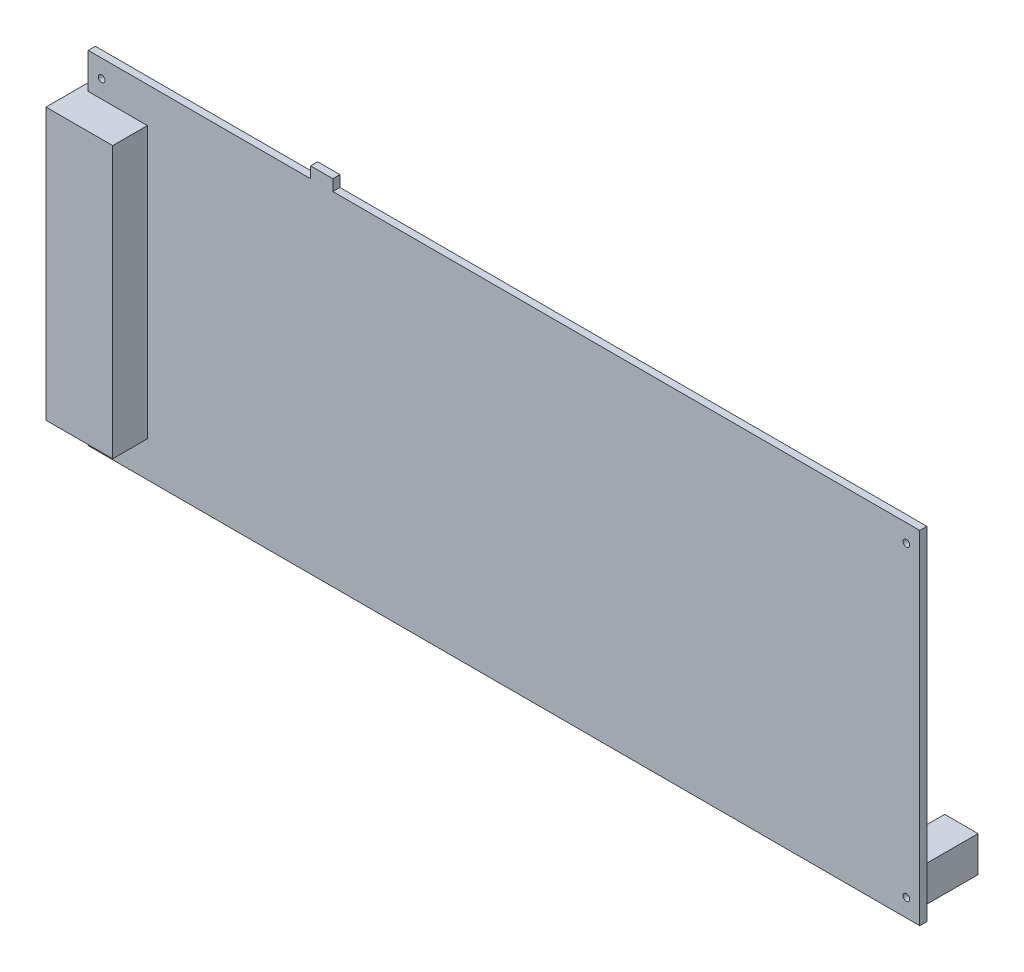
ISO-10303-21;
HEADER;
FILE_DESCRIPTION(('STEP AP214'),'2;1');
FILE_NAME('part.step','',(''),(''),'','','');
FILE_SCHEMA(('AUTOMOTIVE_DESIGN { 1 0 10303 214 1 1 1 1 }'));
ENDSEC;
DATA;
#1=APPLICATION_CONTEXT('core data for automotive mechanical design processes');
#2=APPLICATION_PROTOCOL_DEFINITION('international standard','automotive_design',2000,#1);
#3=PRODUCT_CONTEXT('',#1,'mechanical');
#4=PRODUCT('Part','Part','',(#3));
#5=PRODUCT_RELATED_PRODUCT_CATEGORY('part','',(#4));
#6=PRODUCT_DEFINITION_FORMATION('','',#4);
#7=PRODUCT_DEFINITION_CONTEXT('part definition',#1,'design');
#8=PRODUCT_DEFINITION('design','',#6,#7);
#9=PRODUCT_DEFINITION_SHAPE('','',#8);
#10=(LENGTH_UNIT() NAMED_UNIT(*) SI_UNIT(.MILLI.,.METRE.));
#11=(NAMED_UNIT(*) PLANE_ANGLE_UNIT() SI_UNIT($,.RADIAN.));
#12=(NAMED_UNIT(*) SI_UNIT($,.STERADIAN.) SOLID_ANGLE_UNIT());
#13=UNCERTAINTY_MEASURE_WITH_UNIT(LENGTH_MEASURE(1.E-05),#10,'distance_accuracy_value','');
#14=(GEOMETRIC_REPRESENTATION_CONTEXT(3) GLOBAL_UNCERTAINTY_ASSIGNED_CONTEXT((#13)) GLOBAL_UNIT_ASSIGNED_CONTEXT((#10,
#11,#12)) REPRESENTATION_CONTEXT('',''));
#15=CARTESIAN_POINT('',(0.,0.,0.));
#16=DIRECTION('',(0.,0.,1.));
#17=DIRECTION('',(1.,0.,0.));
#18=AXIS2_PLACEMENT_3D('',#15,#16,#17);
#19=CARTESIAN_POINT('',(0.,0.,-1.6));
#20=DIRECTION('',(0.,0.,1.));
#21=DIRECTION('',(1.,0.,0.));
#22=AXIS2_PLACEMENT_3D('',#19,#20,#21);
#23=PLANE('',#22);
#24=CARTESIAN_POINT('',(3.0693995,-73.06799966,-1.6));
#25=DIRECTION('',(0.,0.,1.));
#26=DIRECTION('',(1.,0.,0.));
#27=AXIS2_PLACEMENT_3D('',#24,#25,#26);
#28=CIRCLE('',#27,0.7499985);
#29=CARTESIAN_POINT('',(3.819398,-73.06799966,-1.6));
#30=VERTEX_POINT('',#29);
#31=EDGE_CURVE('E302',#30,#30,#28,.T.);
#32=ORIENTED_EDGE('',*,*,#31,.T.);
#33=EDGE_LOOP('',(#32));
#34=FACE_BOUND('',#33,.T.);
#35=CARTESIAN_POINT('',(184.06940072,-4.0680005,-1.6));
#36=DIRECTION('',(0.,0.,1.));
#37=DIRECTION('',(1.,0.,0.));
#38=AXIS2_PLACEMENT_3D('',#35,#36,#37);
#39=CIRCLE('',#38,0.749998500000015);
#40=CARTESIAN_POINT('',(184.81939922,-4.0680005,-1.6));
#41=VERTEX_POINT('',#40);
#42=EDGE_CURVE('E284',#41,#41,#39,.T.);
#43=ORIENTED_EDGE('',*,*,#42,.T.);
#44=EDGE_LOOP('',(#43));
#45=FACE_BOUND('',#44,.T.);
#46=CARTESIAN_POINT('',(184.06940072,-73.06799966,-1.6));
#47=DIRECTION('',(0.,0.,1.));
#48=DIRECTION('',(1.,0.,0.));
#49=AXIS2_PLACEMENT_3D('',#46,#47,#48);
#50=CIRCLE('',#49,0.749998500000015);
#51=CARTESIAN_POINT('',(184.81939922,-73.06799966,-1.6));
#52=VERTEX_POINT('',#51);
#53=EDGE_CURVE('E297',#52,#52,#50,.T.);
#54=ORIENTED_EDGE('',*,*,#53,.T.);
#55=EDGE_LOOP('',(#54));
#56=FACE_BOUND('',#55,.T.);
#57=CARTESIAN_POINT('',(3.0693995,-4.0680005,-1.6));
#58=DIRECTION('',(0.,0.,1.));
#59=DIRECTION('',(1.,0.,0.));
#60=AXIS2_PLACEMENT_3D('',#57,#58,#59);
#61=CIRCLE('',#60,0.7499985);
#62=CARTESIAN_POINT('',(3.819398,-4.0680005,-1.6));
#63=VERTEX_POINT('',#62);
#64=EDGE_CURVE('E290',#63,#63,#61,.T.);
#65=ORIENTED_EDGE('',*,*,#64,.T.);
#66=EDGE_LOOP('',(#65));
#67=FACE_BOUND('',#66,.T.);
#68=DIRECTION('',(0.,-1.,0.));
#69=VECTOR('',#68,1.);
#70=CARTESIAN_POINT('',(182.06940742,-78.66797642,-1.6));
#71=LINE('',#70,#69);
#72=CARTESIAN_POINT('',(182.06940742,-70.66797642,-1.6));
#73=VERTEX_POINT('',#72);
#74=CARTESIAN_POINT('',(182.06940742,-77.06797642,-1.6));
#75=VERTEX_POINT('',#74);
#76=EDGE_CURVE('E679',#73,#75,#71,.T.);
#77=ORIENTED_EDGE('',*,*,#76,.F.);
#78=DIRECTION('',(1.,0.,0.));
#79=VECTOR('',#78,1.);
#80=CARTESIAN_POINT('',(182.06940742,-70.66797642,-1.6));
#81=LINE('',#80,#79);
#82=CARTESIAN_POINT('',(174.56940742,-70.66797642,-1.6));
#83=VERTEX_POINT('',#82);
#84=EDGE_CURVE('E52',#83,#73,#81,.T.);
#85=ORIENTED_EDGE('',*,*,#84,.F.);
#86=DIRECTION('',(0.,1.,0.));
#87=VECTOR('',#86,1.);
#88=CARTESIAN_POINT('',(174.56940742,0.,-1.6));
#89=LINE('',#88,#87);
#90=CARTESIAN_POINT('',(174.56940742,-77.06797642,-1.6));
#91=VERTEX_POINT('',#90);
#92=EDGE_CURVE('E11',#91,#83,#89,.T.);
#93=ORIENTED_EDGE('',*,*,#92,.F.);
#94=DIRECTION('',(1.,0.,0.));
#95=VECTOR('',#94,1.);
#96=CARTESIAN_POINT('',(0.06942582,-77.06797642,-1.6));
#97=LINE('',#96,#95);
#98=CARTESIAN_POINT('',(0.06942582,-77.06797642,-1.6));
#99=VERTEX_POINT('',#98);
#100=EDGE_CURVE('E308',#99,#91,#97,.T.);
#101=ORIENTED_EDGE('',*,*,#100,.F.);
#102=DIRECTION('',(0.,-1.,0.));
#103=VECTOR('',#102,1.);
#104=CARTESIAN_POINT('',(0.06942582,-77.06797642,-1.6));
#105=LINE('',#104,#103);
#106=CARTESIAN_POINT('',(0.06942582,-69.06797642,-1.6));
#107=VERTEX_POINT('',#106);
#108=EDGE_CURVE('E318',#107,#99,#105,.T.);
#109=ORIENTED_EDGE('',*,*,#108,.F.);
#110=DIRECTION('',(1.,0.,0.));
#111=VECTOR('',#110,1.);
#112=CARTESIAN_POINT('',(0.,-69.06797642,-1.6));
#113=LINE('',#112,#111);
#114=CARTESIAN_POINT('',(13.36942582,-69.06797642,-1.6));
#115=VERTEX_POINT('',#114);
#116=EDGE_CURVE('E274',#107,#115,#113,.T.);
#117=ORIENTED_EDGE('',*,*,#116,.T.);
#118=DIRECTION('',(0.,1.,0.));
#119=VECTOR('',#118,1.);
#120=CARTESIAN_POINT('',(13.36942582,0.,-1.6));
#121=LINE('',#120,#119);
#122=CARTESIAN_POINT('',(13.36942582,-8.06797802,-1.6));
#123=VERTEX_POINT('',#122);
#124=EDGE_CURVE('E276',#115,#123,#121,.T.);
#125=ORIENTED_EDGE('',*,*,#124,.T.);
#126=DIRECTION('',(-1.,0.,0.));
#127=VECTOR('',#126,1.);
#128=CARTESIAN_POINT('',(0.,-8.06797802,-1.6));
#129=LINE('',#128,#127);
#130=CARTESIAN_POINT('',(0.06942582,-8.06797802000001,-1.6));
#131=VERTEX_POINT('',#130);
#132=EDGE_CURVE('E281',#123,#131,#129,.T.);
#133=ORIENTED_EDGE('',*,*,#132,.T.);
#134=CARTESIAN_POINT('',(0.06942582,-0.06797802,-1.6));
#135=VERTEX_POINT('',#134);
#136=EDGE_CURVE('E319',#135,#131,#105,.T.);
#137=ORIENTED_EDGE('',*,*,#136,.F.);
#138=DIRECTION('',(-1.,0.,0.));
#139=VECTOR('',#138,1.);
#140=CARTESIAN_POINT('',(0.06942582,-0.06797802,-1.6));
#141=LINE('',#140,#139);
#142=CARTESIAN_POINT('',(50.06942582,-0.06797802,-1.6));
#143=VERTEX_POINT('',#142);
#144=EDGE_CURVE('E315',#143,#135,#141,.T.);
#145=ORIENTED_EDGE('',*,*,#144,.F.);
#146=DIRECTION('',(0.,-1.,0.));
#147=VECTOR('',#146,1.);
#148=CARTESIAN_POINT('',(50.06942582,2.43202198,-1.6));
#149=LINE('',#148,#147);
#150=CARTESIAN_POINT('',(50.06942582,2.43202198,-1.6));
#151=VERTEX_POINT('',#150);
#152=EDGE_CURVE('E220',#151,#143,#149,.T.);
#153=ORIENTED_EDGE('',*,*,#152,.F.);
#154=DIRECTION('',(-1.,0.,0.));
#155=VECTOR('',#154,1.);
#156=CARTESIAN_POINT('',(50.06942582,2.43202198,-1.6));
#157=LINE('',#156,#155);
#158=CARTESIAN_POINT('',(55.06942582,2.43202198,-1.6));
#159=VERTEX_POINT('',#158);
#160=EDGE_CURVE('E219',#159,#151,#157,.T.);
#161=ORIENTED_EDGE('',*,*,#160,.F.);
#162=DIRECTION('',(0.,-1.,0.));
#163=VECTOR('',#162,1.);
#164=CARTESIAN_POINT('',(55.06942582,2.43202198,-1.6));
#165=LINE('',#164,#163);
#166=CARTESIAN_POINT('',(55.06942582,-0.06797802,-1.6));
#167=VERTEX_POINT('',#166);
#168=EDGE_CURVE('E226',#159,#167,#165,.T.);
#169=ORIENTED_EDGE('',*,*,#168,.T.);
#170=CARTESIAN_POINT('',(187.06940742,-0.06797802,-1.6));
#171=VERTEX_POINT('',#170);
#172=EDGE_CURVE('E316',#171,#167,#141,.T.);
#173=ORIENTED_EDGE('',*,*,#172,.F.);
#174=DIRECTION('',(0.,1.,0.));
#175=VECTOR('',#174,1.);
#176=CARTESIAN_POINT('',(187.06940742,-77.06797642,-1.6));
#177=LINE('',#176,#175);
#178=CARTESIAN_POINT('',(187.06940742,-77.06797642,-1.6));
#179=VERTEX_POINT('',#178);
#180=EDGE_CURVE('E311',#179,#171,#177,.T.);
#181=ORIENTED_EDGE('',*,*,#180,.F.);
#182=EDGE_CURVE('E57',#75,#179,#97,.T.);
#183=ORIENTED_EDGE('',*,*,#182,.F.);
#184=EDGE_LOOP('',(#77,#85,#93,#101,#109,#117,#125,#133,#137,#145,#153,#161,#169,#173,#181,#183));
#185=FACE_BOUND('',#184,.T.);
#186=ADVANCED_FACE('F37',(#34,#45,#56,#67,#185),#23,.F.);
#187=CARTESIAN_POINT('',(0.06942582,-0.06797802,-1.6));
#188=DIRECTION('',(0.,1.,0.));
#189=DIRECTION('',(0.,0.,1.));
#190=AXIS2_PLACEMENT_3D('',#187,#188,#189);
#191=PLANE('',#190);
#192=DIRECTION('',(0.,0.,1.));
#193=VECTOR('',#192,1.);
#194=CARTESIAN_POINT('',(50.06942582,-0.06797802,-1.6));
#195=LINE('',#194,#193);
#196=CARTESIAN_POINT('',(50.06942582,-0.06797802,0.));
#197=VERTEX_POINT('',#196);
#198=EDGE_CURVE('E203',#143,#197,#195,.T.);
#199=ORIENTED_EDGE('',*,*,#198,.F.);
#200=ORIENTED_EDGE('',*,*,#144,.T.);
#201=DIRECTION('',(0.,0.,1.));
#202=VECTOR('',#201,1.);
#203=CARTESIAN_POINT('',(0.06942582,-0.06797802,-1.6));
#204=LINE('',#203,#202);
#205=CARTESIAN_POINT('',(0.06942582,-0.06797802,0.));
#206=VERTEX_POINT('',#205);
#207=EDGE_CURVE('E340',#135,#206,#204,.T.);
#208=ORIENTED_EDGE('',*,*,#207,.T.);
#209=DIRECTION('',(-1.,0.,0.));
#210=VECTOR('',#209,1.);
#211=CARTESIAN_POINT('',(0.06942582,-0.06797802,0.));
#212=LINE('',#211,#210);
#213=EDGE_CURVE('E328',#197,#206,#212,.T.);
#214=ORIENTED_EDGE('',*,*,#213,.F.);
#215=EDGE_LOOP('',(#199,#200,#208,#214));
#216=FACE_BOUND('',#215,.T.);
#217=ADVANCED_FACE('F414',(#216),#191,.T.);
#218=CARTESIAN_POINT('',(0.06942582,-77.06797642,-1.6));
#219=DIRECTION('',(-1.,0.,0.));
#220=DIRECTION('',(0.,0.,1.));
#221=AXIS2_PLACEMENT_3D('',#218,#219,#220);
#222=PLANE('',#221);
#223=DIRECTION('',(0.,0.,-1.));
#224=VECTOR('',#223,1.);
#225=CARTESIAN_POINT('',(0.06942582,-8.06797802000001,-1.6));
#226=LINE('',#225,#224);
#227=CARTESIAN_POINT('',(0.06942582,-8.06797802000001,0.));
#228=VERTEX_POINT('',#227);
#229=EDGE_CURVE('E278',#228,#131,#226,.T.);
#230=ORIENTED_EDGE('',*,*,#229,.F.);
#231=DIRECTION('',(0.,-1.,0.));
#232=VECTOR('',#231,1.);
#233=CARTESIAN_POINT('',(0.06942582,-77.06797642,0.));
#234=LINE('',#233,#232);
#235=EDGE_CURVE('E333',#206,#228,#234,.T.);
#236=ORIENTED_EDGE('',*,*,#235,.F.);
#237=ORIENTED_EDGE('',*,*,#207,.F.);
#238=ORIENTED_EDGE('',*,*,#136,.T.);
#239=EDGE_LOOP('',(#230,#236,#237,#238));
#240=FACE_BOUND('',#239,.T.);
#241=ADVANCED_FACE('F418',(#240),#222,.T.);
#242=CARTESIAN_POINT('',(0.06942582,-77.06797642,-1.6));
#243=DIRECTION('',(0.,-1.,0.));
#244=DIRECTION('',(0.,0.,-1.));
#245=AXIS2_PLACEMENT_3D('',#242,#243,#244);
#246=PLANE('',#245);
#247=DIRECTION('',(1.,0.,0.));
#248=VECTOR('',#247,1.);
#249=CARTESIAN_POINT('',(0.06942582,-77.06797642,0.));
#250=LINE('',#249,#248);
#251=CARTESIAN_POINT('',(0.06942582,-77.06797642,0.));
#252=VERTEX_POINT('',#251);
#253=CARTESIAN_POINT('',(187.06940742,-77.06797642,0.));
#254=VERTEX_POINT('',#253);
#255=EDGE_CURVE('E305',#252,#254,#250,.T.);
#256=ORIENTED_EDGE('',*,*,#255,.F.);
#257=DIRECTION('',(0.,0.,1.));
#258=VECTOR('',#257,1.);
#259=CARTESIAN_POINT('',(0.06942582,-77.06797642,-1.6));
#260=LINE('',#259,#258);
#261=EDGE_CURVE('E336',#99,#252,#260,.T.);
#262=ORIENTED_EDGE('',*,*,#261,.F.);
#263=ORIENTED_EDGE('',*,*,#100,.T.);
#264=EDGE_CURVE('E312',#91,#75,#97,.T.);
#265=ORIENTED_EDGE('',*,*,#264,.T.);
#266=ORIENTED_EDGE('',*,*,#182,.T.);
#267=DIRECTION('',(0.,0.,1.));
#268=VECTOR('',#267,1.);
#269=CARTESIAN_POINT('',(187.06940742,-77.06797642,-1.6));
#270=LINE('',#269,#268);
#271=EDGE_CURVE('E322',#179,#254,#270,.T.);
#272=ORIENTED_EDGE('',*,*,#271,.T.);
#273=EDGE_LOOP('',(#256,#262,#263,#265,#266,#272));
#274=FACE_BOUND('',#273,.T.);
#275=ADVANCED_FACE('F39',(#274),#246,.T.);
#276=DIRECTION('',(0.,0.,1.));
#277=VECTOR('',#276,1.);
#278=CARTESIAN_POINT('',(0.06942582,-69.06797642,-1.6));
#279=LINE('',#278,#277);
#280=CARTESIAN_POINT('',(0.06942582,-69.06797642,0.));
#281=VERTEX_POINT('',#280);
#282=EDGE_CURVE('E262',#107,#281,#279,.T.);
#283=ORIENTED_EDGE('',*,*,#282,.F.);
#284=ORIENTED_EDGE('',*,*,#108,.T.);
#285=ORIENTED_EDGE('',*,*,#261,.T.);
#286=EDGE_CURVE('E332',#281,#252,#234,.T.);
#287=ORIENTED_EDGE('',*,*,#286,.F.);
#288=EDGE_LOOP('',(#283,#284,#285,#287));
#289=FACE_BOUND('',#288,.T.);
#290=ADVANCED_FACE('F386',(#289),#222,.T.);
#291=DIRECTION('',(0.,0.,-1.));
#292=VECTOR('',#291,1.);
#293=CARTESIAN_POINT('',(55.06942582,-0.06797802,-1.6));
#294=LINE('',#293,#292);
#295=CARTESIAN_POINT('',(55.06942582,-0.06797802,0.));
#296=VERTEX_POINT('',#295);
#297=EDGE_CURVE('E206',#296,#167,#294,.T.);
#298=ORIENTED_EDGE('',*,*,#297,.F.);
#299=CARTESIAN_POINT('',(187.06940742,-0.06797802,0.));
#300=VERTEX_POINT('',#299);
#301=EDGE_CURVE('E329',#300,#296,#212,.T.);
#302=ORIENTED_EDGE('',*,*,#301,.F.);
#303=DIRECTION('',(0.,0.,1.));
#304=VECTOR('',#303,1.);
#305=CARTESIAN_POINT('',(187.06940742,-0.06797802,-1.6));
#306=LINE('',#305,#304);
#307=EDGE_CURVE('E343',#171,#300,#306,.T.);
#308=ORIENTED_EDGE('',*,*,#307,.F.);
#309=ORIENTED_EDGE('',*,*,#172,.T.);
#310=EDGE_LOOP('',(#298,#302,#308,#309));
#311=FACE_BOUND('',#310,.T.);
#312=ADVANCED_FACE('F399',(#311),#191,.T.);
#313=CARTESIAN_POINT('',(187.06940742,-77.06797642,-1.6));
#314=DIRECTION('',(1.,0.,0.));
#315=DIRECTION('',(0.,0.,-1.));
#316=AXIS2_PLACEMENT_3D('',#313,#314,#315);
#317=PLANE('',#316);
#318=DIRECTION('',(0.,1.,0.));
#319=VECTOR('',#318,1.);
#320=CARTESIAN_POINT('',(187.06940742,-77.06797642,0.));
#321=LINE('',#320,#319);
#322=EDGE_CURVE('E325',#254,#300,#321,.T.);
#323=ORIENTED_EDGE('',*,*,#322,.F.);
#324=ORIENTED_EDGE('',*,*,#271,.F.);
#325=ORIENTED_EDGE('',*,*,#180,.T.);
#326=ORIENTED_EDGE('',*,*,#307,.T.);
#327=EDGE_LOOP('',(#323,#324,#325,#326));
#328=FACE_BOUND('',#327,.T.);
#329=ADVANCED_FACE('F396',(#328),#317,.T.);
#330=CARTESIAN_POINT('',(0.,0.,0.));
#331=DIRECTION('',(0.,0.,1.));
#332=DIRECTION('',(1.,0.,0.));
#333=AXIS2_PLACEMENT_3D('',#330,#331,#332);
#334=PLANE('',#333);
#335=DIRECTION('',(-1.,0.,0.));
#336=VECTOR('',#335,1.);
#337=CARTESIAN_POINT('',(0.,-8.06797802,0.));
#338=LINE('',#337,#336);
#339=CARTESIAN_POINT('',(13.36942582,-8.06797802,0.));
#340=VERTEX_POINT('',#339);
#341=EDGE_CURVE('E45',#340,#228,#338,.T.);
#342=ORIENTED_EDGE('',*,*,#341,.F.);
#343=DIRECTION('',(0.,1.,0.));
#344=VECTOR('',#343,1.);
#345=CARTESIAN_POINT('',(13.36942582,0.,0.));
#346=LINE('',#345,#344);
#347=CARTESIAN_POINT('',(13.36942582,-69.06797642,0.));
#348=VERTEX_POINT('',#347);
#349=EDGE_CURVE('E348',#348,#340,#346,.T.);
#350=ORIENTED_EDGE('',*,*,#349,.F.);
#351=DIRECTION('',(1.,0.,0.));
#352=VECTOR('',#351,1.);
#353=CARTESIAN_POINT('',(0.,-69.06797642,0.));
#354=LINE('',#353,#352);
#355=EDGE_CURVE('E339',#281,#348,#354,.T.);
#356=ORIENTED_EDGE('',*,*,#355,.F.);
#357=ORIENTED_EDGE('',*,*,#286,.T.);
#358=ORIENTED_EDGE('',*,*,#255,.T.);
#359=ORIENTED_EDGE('',*,*,#322,.T.);
#360=ORIENTED_EDGE('',*,*,#301,.T.);
#361=DIRECTION('',(0.,-1.,0.));
#362=VECTOR('',#361,1.);
#363=CARTESIAN_POINT('',(55.06942582,2.43202198,0.));
#364=LINE('',#363,#362);
#365=CARTESIAN_POINT('',(55.06942582,2.43202198,0.));
#366=VERTEX_POINT('',#365);
#367=EDGE_CURVE('E229',#366,#296,#364,.T.);
#368=ORIENTED_EDGE('',*,*,#367,.F.);
#369=DIRECTION('',(1.,0.,0.));
#370=VECTOR('',#369,1.);
#371=CARTESIAN_POINT('',(50.06942582,2.43202198,0.));
#372=LINE('',#371,#370);
#373=CARTESIAN_POINT('',(50.06942582,2.43202198,0.));
#374=VERTEX_POINT('',#373);
#375=EDGE_CURVE('E215',#374,#366,#372,.T.);
#376=ORIENTED_EDGE('',*,*,#375,.F.);
#377=DIRECTION('',(0.,-1.,0.));
#378=VECTOR('',#377,1.);
#379=CARTESIAN_POINT('',(50.06942582,2.43202198,0.));
#380=LINE('',#379,#378);
#381=EDGE_CURVE('E232',#374,#197,#380,.T.);
#382=ORIENTED_EDGE('',*,*,#381,.T.);
#383=ORIENTED_EDGE('',*,*,#213,.T.);
#384=ORIENTED_EDGE('',*,*,#235,.T.);
#385=EDGE_LOOP('',(#342,#350,#356,#357,#358,#359,#360,#368,#376,#382,#383,#384));
#386=FACE_BOUND('',#385,.T.);
#387=CARTESIAN_POINT('',(3.0693995,-4.0680005,0.));
#388=DIRECTION('',(0.,0.,1.));
#389=DIRECTION('',(1.,0.,0.));
#390=AXIS2_PLACEMENT_3D('',#387,#388,#389);
#391=CIRCLE('',#390,0.7499985);
#392=CARTESIAN_POINT('',(3.819398,-4.0680005,0.));
#393=VERTEX_POINT('',#392);
#394=EDGE_CURVE('E294',#393,#393,#391,.T.);
#395=ORIENTED_EDGE('',*,*,#394,.F.);
#396=EDGE_LOOP('',(#395));
#397=FACE_BOUND('',#396,.T.);
#398=CARTESIAN_POINT('',(184.06940072,-73.06799966,0.));
#399=DIRECTION('',(0.,0.,1.));
#400=DIRECTION('',(1.,0.,0.));
#401=AXIS2_PLACEMENT_3D('',#398,#399,#400);
#402=CIRCLE('',#401,0.749998500000015);
#403=CARTESIAN_POINT('',(184.81939922,-73.06799966,0.));
#404=VERTEX_POINT('',#403);
#405=EDGE_CURVE('E287',#404,#404,#402,.T.);
#406=ORIENTED_EDGE('',*,*,#405,.F.);
#407=EDGE_LOOP('',(#406));
#408=FACE_BOUND('',#407,.T.);
#409=CARTESIAN_POINT('',(184.06940072,-4.0680005,0.));
#410=DIRECTION('',(0.,0.,1.));
#411=DIRECTION('',(1.,0.,0.));
#412=AXIS2_PLACEMENT_3D('',#409,#410,#411);
#413=CIRCLE('',#412,0.749998500000015);
#414=CARTESIAN_POINT('',(184.81939922,-4.0680005,0.));
#415=VERTEX_POINT('',#414);
#416=EDGE_CURVE('E283',#415,#415,#413,.T.);
#417=ORIENTED_EDGE('',*,*,#416,.F.);
#418=EDGE_LOOP('',(#417));
#419=FACE_BOUND('',#418,.T.);
#420=CARTESIAN_POINT('',(3.0693995,-73.06799966,0.));
#421=DIRECTION('',(0.,0.,1.));
#422=DIRECTION('',(1.,0.,0.));
#423=AXIS2_PLACEMENT_3D('',#420,#421,#422);
#424=CIRCLE('',#423,0.7499985);
#425=CARTESIAN_POINT('',(3.819398,-73.06799966,0.));
#426=VERTEX_POINT('',#425);
#427=EDGE_CURVE('E293',#426,#426,#424,.T.);
#428=ORIENTED_EDGE('',*,*,#427,.F.);
#429=EDGE_LOOP('',(#428));
#430=FACE_BOUND('',#429,.T.);
#431=ADVANCED_FACE('F357',(#386,#397,#408,#419,#430),#334,.T.);
#432=CARTESIAN_POINT('',(3.0693995,-73.06799966,-1.6));
#433=DIRECTION('',(0.,0.,1.));
#434=DIRECTION('',(1.,0.,0.));
#435=AXIS2_PLACEMENT_3D('',#432,#433,#434);
#436=CYLINDRICAL_SURFACE('',#435,0.7499985);
#437=ORIENTED_EDGE('',*,*,#31,.F.);
#438=EDGE_LOOP('',(#437));
#439=FACE_BOUND('',#438,.T.);
#440=ORIENTED_EDGE('',*,*,#427,.T.);
#441=EDGE_LOOP('',(#440));
#442=FACE_BOUND('',#441,.T.);
#443=ADVANCED_FACE('F437',(#439,#442),#436,.F.);
#444=CARTESIAN_POINT('',(184.06940072,-4.0680005,-1.6));
#445=DIRECTION('',(0.,0.,1.));
#446=DIRECTION('',(1.,0.,0.));
#447=AXIS2_PLACEMENT_3D('',#444,#445,#446);
#448=CYLINDRICAL_SURFACE('',#447,0.749998500000015);
#449=ORIENTED_EDGE('',*,*,#42,.F.);
#450=EDGE_LOOP('',(#449));
#451=FACE_BOUND('',#450,.T.);
#452=ORIENTED_EDGE('',*,*,#416,.T.);
#453=EDGE_LOOP('',(#452));
#454=FACE_BOUND('',#453,.T.);
#455=ADVANCED_FACE('F444',(#451,#454),#448,.F.);
#456=CARTESIAN_POINT('',(184.06940072,-73.06799966,-1.6));
#457=DIRECTION('',(0.,0.,1.));
#458=DIRECTION('',(1.,0.,0.));
#459=AXIS2_PLACEMENT_3D('',#456,#457,#458);
#460=CYLINDRICAL_SURFACE('',#459,0.749998500000015);
#461=ORIENTED_EDGE('',*,*,#53,.F.);
#462=EDGE_LOOP('',(#461));
#463=FACE_BOUND('',#462,.T.);
#464=ORIENTED_EDGE('',*,*,#405,.T.);
#465=EDGE_LOOP('',(#464));
#466=FACE_BOUND('',#465,.T.);
#467=ADVANCED_FACE('F564',(#463,#466),#460,.F.);
#468=CARTESIAN_POINT('',(3.0693995,-4.0680005,-1.6));
#469=DIRECTION('',(0.,0.,1.));
#470=DIRECTION('',(1.,0.,0.));
#471=AXIS2_PLACEMENT_3D('',#468,#469,#470);
#472=CYLINDRICAL_SURFACE('',#471,0.7499985);
#473=ORIENTED_EDGE('',*,*,#64,.F.);
#474=EDGE_LOOP('',(#473));
#475=FACE_BOUND('',#474,.T.);
#476=ORIENTED_EDGE('',*,*,#394,.T.);
#477=EDGE_LOOP('',(#476));
#478=FACE_BOUND('',#477,.T.);
#479=ADVANCED_FACE('F555',(#475,#478),#472,.F.);
#480=CARTESIAN_POINT('',(-1.63057418,-8.06797802,-9.6));
#481=DIRECTION('',(0.,1.,0.));
#482=DIRECTION('',(-1.,0.,0.));
#483=AXIS2_PLACEMENT_3D('',#480,#481,#482);
#484=PLANE('',#483);
#485=ORIENTED_EDGE('',*,*,#132,.F.);
#486=DIRECTION('',(0.,0.,1.));
#487=VECTOR('',#486,1.);
#488=CARTESIAN_POINT('',(13.36942582,-8.06797802,-9.6));
#489=LINE('',#488,#487);
#490=CARTESIAN_POINT('',(13.36942582,-8.06797802,-9.6));
#491=VERTEX_POINT('',#490);
#492=EDGE_CURVE('E263',#491,#123,#489,.T.);
#493=ORIENTED_EDGE('',*,*,#492,.F.);
#494=DIRECTION('',(-1.,0.,0.));
#495=VECTOR('',#494,1.);
#496=CARTESIAN_POINT('',(-1.63057418,-8.06797802,-9.6));
#497=LINE('',#496,#495);
#498=CARTESIAN_POINT('',(-1.63057418,-8.06797802,-9.6));
#499=VERTEX_POINT('',#498);
#500=EDGE_CURVE('E256',#491,#499,#497,.T.);
#501=ORIENTED_EDGE('',*,*,#500,.T.);
#502=DIRECTION('',(0.,0.,1.));
#503=VECTOR('',#502,1.);
#504=CARTESIAN_POINT('',(-1.63057418,-8.06797802,-9.6));
#505=LINE('',#504,#503);
#506=CARTESIAN_POINT('',(-1.63057418,-8.06797802,7.8));
#507=VERTEX_POINT('',#506);
#508=EDGE_CURVE('E260',#499,#507,#505,.T.);
#509=ORIENTED_EDGE('',*,*,#508,.T.);
#510=DIRECTION('',(-1.,0.,0.));
#511=VECTOR('',#510,1.);
#512=CARTESIAN_POINT('',(-1.63057418,-8.06797802,7.8));
#513=LINE('',#512,#511);
#514=CARTESIAN_POINT('',(13.36942582,-8.06797802,7.8));
#515=VERTEX_POINT('',#514);
#516=EDGE_CURVE('E244',#515,#507,#513,.T.);
#517=ORIENTED_EDGE('',*,*,#516,.F.);
#518=EDGE_CURVE('E266',#340,#515,#489,.T.);
#519=ORIENTED_EDGE('',*,*,#518,.F.);
#520=ORIENTED_EDGE('',*,*,#341,.T.);
#521=ORIENTED_EDGE('',*,*,#229,.T.);
#522=EDGE_LOOP('',(#485,#493,#501,#509,#517,#519,#520,#521));
#523=FACE_BOUND('',#522,.T.);
#524=ADVANCED_FACE('F354',(#523),#484,.T.);
#525=CARTESIAN_POINT('',(13.36942582,-8.06797802,-9.6));
#526=DIRECTION('',(1.,0.,0.));
#527=DIRECTION('',(0.,1.,0.));
#528=AXIS2_PLACEMENT_3D('',#525,#526,#527);
#529=PLANE('',#528);
#530=ORIENTED_EDGE('',*,*,#124,.F.);
#531=DIRECTION('',(0.,0.,1.));
#532=VECTOR('',#531,1.);
#533=CARTESIAN_POINT('',(13.36942582,-69.06797642,-9.6));
#534=LINE('',#533,#532);
#535=CARTESIAN_POINT('',(13.36942582,-69.06797642,-9.6));
#536=VERTEX_POINT('',#535);
#537=EDGE_CURVE('E267',#536,#115,#534,.T.);
#538=ORIENTED_EDGE('',*,*,#537,.F.);
#539=DIRECTION('',(0.,1.,0.));
#540=VECTOR('',#539,1.);
#541=CARTESIAN_POINT('',(13.36942582,-8.06797802,-9.6));
#542=LINE('',#541,#540);
#543=EDGE_CURVE('E253',#536,#491,#542,.T.);
#544=ORIENTED_EDGE('',*,*,#543,.T.);
#545=ORIENTED_EDGE('',*,*,#492,.T.);
#546=EDGE_LOOP('',(#530,#538,#544,#545));
#547=FACE_BOUND('',#546,.T.);
#548=ADVANCED_FACE('F381',(#547),#529,.T.);
#549=CARTESIAN_POINT('',(-1.63057418,-69.06797642,-9.6));
#550=DIRECTION('',(0.,-1.,0.));
#551=DIRECTION('',(0.,0.,-1.));
#552=AXIS2_PLACEMENT_3D('',#549,#550,#551);
#553=PLANE('',#552);
#554=ORIENTED_EDGE('',*,*,#116,.F.);
#555=ORIENTED_EDGE('',*,*,#282,.T.);
#556=ORIENTED_EDGE('',*,*,#355,.T.);
#557=CARTESIAN_POINT('',(13.36942582,-69.06797642,7.8));
#558=VERTEX_POINT('',#557);
#559=EDGE_CURVE('E270',#348,#558,#534,.T.);
#560=ORIENTED_EDGE('',*,*,#559,.T.);
#561=DIRECTION('',(1.,0.,0.));
#562=VECTOR('',#561,1.);
#563=CARTESIAN_POINT('',(-1.63057418,-69.06797642,7.8));
#564=LINE('',#563,#562);
#565=CARTESIAN_POINT('',(-1.63057418,-69.06797642,7.8));
#566=VERTEX_POINT('',#565);
#567=EDGE_CURVE('E238',#566,#558,#564,.T.);
#568=ORIENTED_EDGE('',*,*,#567,.F.);
#569=DIRECTION('',(0.,0.,1.));
#570=VECTOR('',#569,1.);
#571=CARTESIAN_POINT('',(-1.63057418,-69.06797642,-9.6));
#572=LINE('',#571,#570);
#573=CARTESIAN_POINT('',(-1.63057418,-69.06797642,-9.6));
#574=VERTEX_POINT('',#573);
#575=EDGE_CURVE('E259',#574,#566,#572,.T.);
#576=ORIENTED_EDGE('',*,*,#575,.F.);
#577=DIRECTION('',(1.,0.,0.));
#578=VECTOR('',#577,1.);
#579=CARTESIAN_POINT('',(-1.63057418,-69.06797642,-9.6));
#580=LINE('',#579,#578);
#581=EDGE_CURVE('E250',#574,#536,#580,.T.);
#582=ORIENTED_EDGE('',*,*,#581,.T.);
#583=ORIENTED_EDGE('',*,*,#537,.T.);
#584=EDGE_LOOP('',(#554,#555,#556,#560,#568,#576,#582,#583));
#585=FACE_BOUND('',#584,.T.);
#586=ADVANCED_FACE('F367',(#585),#553,.T.);
#587=CARTESIAN_POINT('',(-1.63057418,-8.06797802,-9.6));
#588=DIRECTION('',(-1.,0.,0.));
#589=DIRECTION('',(0.,-1.,0.));
#590=AXIS2_PLACEMENT_3D('',#587,#588,#589);
#591=PLANE('',#590);
#592=ORIENTED_EDGE('',*,*,#575,.T.);
#593=DIRECTION('',(0.,-1.,0.));
#594=VECTOR('',#593,1.);
#595=CARTESIAN_POINT('',(-1.63057418,-8.06797802,7.8));
#596=LINE('',#595,#594);
#597=EDGE_CURVE('E235',#507,#566,#596,.T.);
#598=ORIENTED_EDGE('',*,*,#597,.F.);
#599=ORIENTED_EDGE('',*,*,#508,.F.);
#600=DIRECTION('',(0.,-1.,0.));
#601=VECTOR('',#600,1.);
#602=CARTESIAN_POINT('',(-1.63057418,-8.06797802,-9.6));
#603=LINE('',#602,#601);
#604=EDGE_CURVE('E247',#499,#574,#603,.T.);
#605=ORIENTED_EDGE('',*,*,#604,.T.);
#606=EDGE_LOOP('',(#592,#598,#599,#605));
#607=FACE_BOUND('',#606,.T.);
#608=ADVANCED_FACE('F372',(#607),#591,.T.);
#609=ORIENTED_EDGE('',*,*,#559,.F.);
#610=ORIENTED_EDGE('',*,*,#349,.T.);
#611=ORIENTED_EDGE('',*,*,#518,.T.);
#612=DIRECTION('',(0.,1.,0.));
#613=VECTOR('',#612,1.);
#614=CARTESIAN_POINT('',(13.36942582,-8.06797802,7.8));
#615=LINE('',#614,#613);
#616=EDGE_CURVE('E241',#558,#515,#615,.T.);
#617=ORIENTED_EDGE('',*,*,#616,.F.);
#618=EDGE_LOOP('',(#609,#610,#611,#617));
#619=FACE_BOUND('',#618,.T.);
#620=ADVANCED_FACE('F362',(#619),#529,.T.);
#621=CARTESIAN_POINT('',(0.,0.,-9.6));
#622=DIRECTION('',(0.,0.,1.));
#623=DIRECTION('',(1.,0.,0.));
#624=AXIS2_PLACEMENT_3D('',#621,#622,#623);
#625=PLANE('',#624);
#626=ORIENTED_EDGE('',*,*,#604,.F.);
#627=ORIENTED_EDGE('',*,*,#500,.F.);
#628=ORIENTED_EDGE('',*,*,#543,.F.);
#629=ORIENTED_EDGE('',*,*,#581,.F.);
#630=EDGE_LOOP('',(#626,#627,#628,#629));
#631=FACE_BOUND('',#630,.T.);
#632=ADVANCED_FACE('F377',(#631),#625,.F.);
#633=CARTESIAN_POINT('',(0.,0.,7.8));
#634=DIRECTION('',(0.,0.,1.));
#635=DIRECTION('',(1.,0.,0.));
#636=AXIS2_PLACEMENT_3D('',#633,#634,#635);
#637=PLANE('',#636);
#638=ORIENTED_EDGE('',*,*,#597,.T.);
#639=ORIENTED_EDGE('',*,*,#567,.T.);
#640=ORIENTED_EDGE('',*,*,#616,.T.);
#641=ORIENTED_EDGE('',*,*,#516,.T.);
#642=EDGE_LOOP('',(#638,#639,#640,#641));
#643=FACE_BOUND('',#642,.T.);
#644=ADVANCED_FACE('F369',(#643),#637,.T.);
#645=CARTESIAN_POINT('',(50.06942582,2.43202198,-1.6));
#646=DIRECTION('',(1.,0.,0.));
#647=DIRECTION('',(0.,0.,-1.));
#648=AXIS2_PLACEMENT_3D('',#645,#646,#647);
#649=PLANE('',#648);
#650=ORIENTED_EDGE('',*,*,#198,.T.);
#651=ORIENTED_EDGE('',*,*,#381,.F.);
#652=DIRECTION('',(0.,0.,1.));
#653=VECTOR('',#652,1.);
#654=CARTESIAN_POINT('',(50.06942582,2.43202198,-1.6));
#655=LINE('',#654,#653);
#656=EDGE_CURVE('E212',#151,#374,#655,.T.);
#657=ORIENTED_EDGE('',*,*,#656,.F.);
#658=ORIENTED_EDGE('',*,*,#152,.T.);
#659=EDGE_LOOP('',(#650,#651,#657,#658));
#660=FACE_BOUND('',#659,.T.);
#661=ADVANCED_FACE('F412',(#660),#649,.F.);
#662=CARTESIAN_POINT('',(55.06942582,2.43202198,-1.6));
#663=DIRECTION('',(-1.,0.,0.));
#664=DIRECTION('',(0.,0.,1.));
#665=AXIS2_PLACEMENT_3D('',#662,#663,#664);
#666=PLANE('',#665);
#667=ORIENTED_EDGE('',*,*,#297,.T.);
#668=ORIENTED_EDGE('',*,*,#168,.F.);
#669=DIRECTION('',(0.,0.,-1.));
#670=VECTOR('',#669,1.);
#671=CARTESIAN_POINT('',(55.06942582,2.43202198,-1.6));
#672=LINE('',#671,#670);
#673=EDGE_CURVE('E217',#366,#159,#672,.T.);
#674=ORIENTED_EDGE('',*,*,#673,.F.);
#675=ORIENTED_EDGE('',*,*,#367,.T.);
#676=EDGE_LOOP('',(#667,#668,#674,#675));
#677=FACE_BOUND('',#676,.T.);
#678=ADVANCED_FACE('F402',(#677),#666,.F.);
#679=CARTESIAN_POINT('',(0.,2.43202198,0.));
#680=DIRECTION('',(0.,1.,0.));
#681=DIRECTION('',(0.,0.,1.));
#682=AXIS2_PLACEMENT_3D('',#679,#680,#681);
#683=PLANE('',#682);
#684=ORIENTED_EDGE('',*,*,#656,.T.);
#685=ORIENTED_EDGE('',*,*,#375,.T.);
#686=ORIENTED_EDGE('',*,*,#673,.T.);
#687=ORIENTED_EDGE('',*,*,#160,.T.);
#688=EDGE_LOOP('',(#684,#685,#686,#687));
#689=FACE_BOUND('',#688,.T.);
#690=ADVANCED_FACE('F409',(#689),#683,.T.);
#691=CARTESIAN_POINT('',(182.06940742,-78.66797642,-18.1));
#692=DIRECTION('',(-1.,0.,0.));
#693=DIRECTION('',(0.,0.,1.));
#694=AXIS2_PLACEMENT_3D('',#691,#692,#693);
#695=PLANE('',#694);
#696=ORIENTED_EDGE('',*,*,#76,.T.);
#697=CARTESIAN_POINT('',(182.06940742,-78.66797642,-1.6));
#698=VERTEX_POINT('',#697);
#699=EDGE_CURVE('E201',#75,#698,#71,.T.);
#700=ORIENTED_EDGE('',*,*,#699,.T.);
#701=DIRECTION('',(0.,0.,1.));
#702=VECTOR('',#701,1.);
#703=CARTESIAN_POINT('',(182.06940742,-78.66797642,-18.1));
#704=LINE('',#703,#702);
#705=CARTESIAN_POINT('',(182.06940742,-78.66797642,-18.1));
#706=VERTEX_POINT('',#705);
#707=EDGE_CURVE('E182',#706,#698,#704,.T.);
#708=ORIENTED_EDGE('',*,*,#707,.F.);
#709=DIRECTION('',(0.,-1.,0.));
#710=VECTOR('',#709,1.);
#711=CARTESIAN_POINT('',(182.06940742,-78.66797642,-18.1));
#712=LINE('',#711,#710);
#713=CARTESIAN_POINT('',(182.06940742,-70.66797642,-18.1));
#714=VERTEX_POINT('',#713);
#715=EDGE_CURVE('E188',#714,#706,#712,.T.);
#716=ORIENTED_EDGE('',*,*,#715,.F.);
#717=DIRECTION('',(0.,0.,1.));
#718=VECTOR('',#717,1.);
#719=CARTESIAN_POINT('',(182.06940742,-70.66797642,-18.1));
#720=LINE('',#719,#718);
#721=EDGE_CURVE('E681',#714,#73,#720,.T.);
#722=ORIENTED_EDGE('',*,*,#721,.T.);
#723=EDGE_LOOP('',(#696,#700,#708,#716,#722));
#724=FACE_BOUND('',#723,.T.);
#725=ADVANCED_FACE('F199',(#724),#695,.F.);
#726=CARTESIAN_POINT('',(182.06940742,-78.66797642,-18.1));
#727=DIRECTION('',(0.,1.,0.));
#728=DIRECTION('',(0.,0.,1.));
#729=AXIS2_PLACEMENT_3D('',#726,#727,#728);
#730=PLANE('',#729);
#731=DIRECTION('',(-1.,0.,0.));
#732=VECTOR('',#731,1.);
#733=CARTESIAN_POINT('',(182.06940742,-78.66797642,-1.6));
#734=LINE('',#733,#732);
#735=CARTESIAN_POINT('',(174.56940742,-78.66797642,-1.6));
#736=VERTEX_POINT('',#735);
#737=EDGE_CURVE('E678',#698,#736,#734,.T.);
#738=ORIENTED_EDGE('',*,*,#737,.T.);
#739=DIRECTION('',(0.,0.,1.));
#740=VECTOR('',#739,1.);
#741=CARTESIAN_POINT('',(174.56940742,-78.66797642,-18.1));
#742=LINE('',#741,#740);
#743=CARTESIAN_POINT('',(174.56940742,-78.66797642,-18.1));
#744=VERTEX_POINT('',#743);
#745=EDGE_CURVE('E184',#744,#736,#742,.T.);
#746=ORIENTED_EDGE('',*,*,#745,.F.);
#747=DIRECTION('',(-1.,0.,0.));
#748=VECTOR('',#747,1.);
#749=CARTESIAN_POINT('',(182.06940742,-78.66797642,-18.1));
#750=LINE('',#749,#748);
#751=EDGE_CURVE('E178',#706,#744,#750,.T.);
#752=ORIENTED_EDGE('',*,*,#751,.F.);
#753=ORIENTED_EDGE('',*,*,#707,.T.);
#754=EDGE_LOOP('',(#738,#746,#752,#753));
#755=FACE_BOUND('',#754,.T.);
#756=ADVANCED_FACE('F180',(#755),#730,.F.);
#757=CARTESIAN_POINT('',(174.56940742,-78.66797642,-18.1));
#758=DIRECTION('',(1.,0.,0.));
#759=DIRECTION('',(0.,0.,-1.));
#760=AXIS2_PLACEMENT_3D('',#757,#758,#759);
#761=PLANE('',#760);
#762=DIRECTION('',(0.,1.,0.));
#763=VECTOR('',#762,1.);
#764=CARTESIAN_POINT('',(174.56940742,-78.66797642,-1.6));
#765=LINE('',#764,#763);
#766=EDGE_CURVE('E682',#736,#91,#765,.T.);
#767=ORIENTED_EDGE('',*,*,#766,.T.);
#768=ORIENTED_EDGE('',*,*,#92,.T.);
#769=DIRECTION('',(0.,0.,1.));
#770=VECTOR('',#769,1.);
#771=CARTESIAN_POINT('',(174.56940742,-70.66797642,-18.1));
#772=LINE('',#771,#770);
#773=CARTESIAN_POINT('',(174.56940742,-70.66797642,-18.1));
#774=VERTEX_POINT('',#773);
#775=EDGE_CURVE('E208',#774,#83,#772,.T.);
#776=ORIENTED_EDGE('',*,*,#775,.F.);
#777=DIRECTION('',(0.,1.,0.));
#778=VECTOR('',#777,1.);
#779=CARTESIAN_POINT('',(174.56940742,-78.66797642,-18.1));
#780=LINE('',#779,#778);
#781=EDGE_CURVE('E187',#744,#774,#780,.T.);
#782=ORIENTED_EDGE('',*,*,#781,.F.);
#783=ORIENTED_EDGE('',*,*,#745,.T.);
#784=EDGE_LOOP('',(#767,#768,#776,#782,#783));
#785=FACE_BOUND('',#784,.T.);
#786=ADVANCED_FACE('F503',(#785),#761,.F.);
#787=CARTESIAN_POINT('',(182.06940742,-70.66797642,-18.1));
#788=DIRECTION('',(0.,-1.,0.));
#789=DIRECTION('',(0.,0.,-1.));
#790=AXIS2_PLACEMENT_3D('',#787,#788,#789);
#791=PLANE('',#790);
#792=ORIENTED_EDGE('',*,*,#84,.T.);
#793=ORIENTED_EDGE('',*,*,#721,.F.);
#794=DIRECTION('',(1.,0.,0.));
#795=VECTOR('',#794,1.);
#796=CARTESIAN_POINT('',(182.06940742,-70.66797642,-18.1));
#797=LINE('',#796,#795);
#798=EDGE_CURVE('E193',#774,#714,#797,.T.);
#799=ORIENTED_EDGE('',*,*,#798,.F.);
#800=ORIENTED_EDGE('',*,*,#775,.T.);
#801=EDGE_LOOP('',(#792,#793,#799,#800));
#802=FACE_BOUND('',#801,.T.);
#803=ADVANCED_FACE('F510',(#802),#791,.F.);
#804=CARTESIAN_POINT('',(0.,0.,-18.1));
#805=DIRECTION('',(0.,0.,1.));
#806=DIRECTION('',(1.,0.,0.));
#807=AXIS2_PLACEMENT_3D('',#804,#805,#806);
#808=PLANE('',#807);
#809=ORIENTED_EDGE('',*,*,#715,.T.);
#810=ORIENTED_EDGE('',*,*,#751,.T.);
#811=ORIENTED_EDGE('',*,*,#781,.T.);
#812=ORIENTED_EDGE('',*,*,#798,.T.);
#813=EDGE_LOOP('',(#809,#810,#811,#812));
#814=FACE_BOUND('',#813,.T.);
#815=ADVANCED_FACE('F191',(#814),#808,.F.);
#816=CARTESIAN_POINT('',(0.,0.,-1.6));
#817=DIRECTION('',(0.,0.,1.));
#818=DIRECTION('',(1.,0.,0.));
#819=AXIS2_PLACEMENT_3D('',#816,#817,#818);
#820=PLANE('',#819);
#821=ORIENTED_EDGE('',*,*,#699,.F.);
#822=ORIENTED_EDGE('',*,*,#264,.F.);
#823=ORIENTED_EDGE('',*,*,#766,.F.);
#824=ORIENTED_EDGE('',*,*,#737,.F.);
#825=EDGE_LOOP('',(#821,#822,#823,#824));
#826=FACE_BOUND('',#825,.T.);
#827=ADVANCED_FACE('F525',(#826),#820,.T.);
#828=CLOSED_SHELL('',(#186,#217,#241,#275,#290,#312,#329,#431,#443,#455,#467,#479,#524,#548,
#586,#608,#620,#632,#644,#661,#678,#690,#725,#756,#786,#803,#815,#827));
#829=MANIFOLD_SOLID_BREP('B2',#828);
#830=ADVANCED_BREP_SHAPE_REPRESENTATION('',(#18,#829),#14);
#831=SHAPE_DEFINITION_REPRESENTATION(#9,#830);
ENDSEC;
END-ISO-10303-21;
